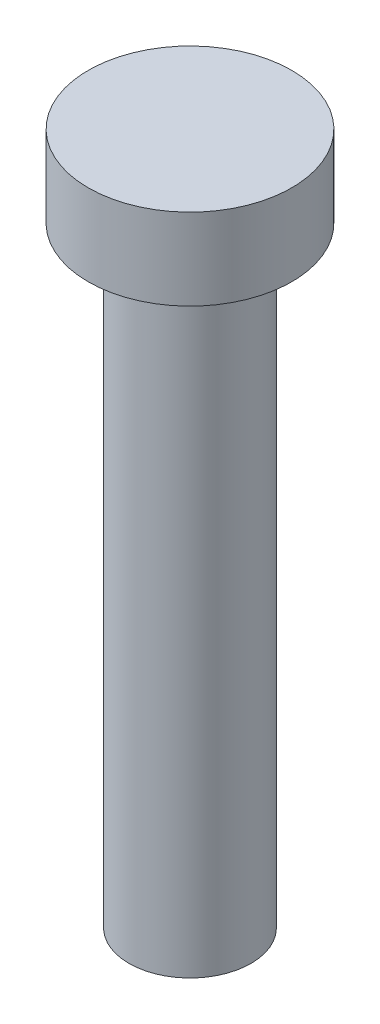
ISO-10303-21;
HEADER;
FILE_DESCRIPTION(('STEP AP214'),'2;1');
FILE_NAME('part.step','',(''),(''),'','','');
FILE_SCHEMA(('AUTOMOTIVE_DESIGN { 1 0 10303 214 1 1 1 1 }'));
ENDSEC;
DATA;
#1=APPLICATION_CONTEXT('core data for automotive mechanical design processes');
#2=APPLICATION_PROTOCOL_DEFINITION('international standard','automotive_design',2000,#1);
#3=PRODUCT_CONTEXT('',#1,'mechanical');
#4=PRODUCT('Part','Part','',(#3));
#5=PRODUCT_RELATED_PRODUCT_CATEGORY('part','',(#4));
#6=PRODUCT_DEFINITION_FORMATION('','',#4);
#7=PRODUCT_DEFINITION_CONTEXT('part definition',#1,'design');
#8=PRODUCT_DEFINITION('design','',#6,#7);
#9=PRODUCT_DEFINITION_SHAPE('','',#8);
#10=(LENGTH_UNIT() NAMED_UNIT(*) SI_UNIT(.MILLI.,.METRE.));
#11=(NAMED_UNIT(*) PLANE_ANGLE_UNIT() SI_UNIT($,.RADIAN.));
#12=(NAMED_UNIT(*) SI_UNIT($,.STERADIAN.) SOLID_ANGLE_UNIT());
#13=UNCERTAINTY_MEASURE_WITH_UNIT(LENGTH_MEASURE(1.E-05),#10,'distance_accuracy_value','');
#14=(GEOMETRIC_REPRESENTATION_CONTEXT(3) GLOBAL_UNCERTAINTY_ASSIGNED_CONTEXT((#13)) GLOBAL_UNIT_ASSIGNED_CONTEXT((#10,
#11,#12)) REPRESENTATION_CONTEXT('',''));
#15=CARTESIAN_POINT('',(0.,0.,0.));
#16=DIRECTION('',(0.,0.,1.));
#17=DIRECTION('',(1.,0.,0.));
#18=AXIS2_PLACEMENT_3D('',#15,#16,#17);
#19=CARTESIAN_POINT('',(0.,15.,0.));
#20=DIRECTION('',(0.,-1.,0.));
#21=DIRECTION('',(0.,0.,-1.));
#22=AXIS2_PLACEMENT_3D('',#19,#20,#21);
#23=CYLINDRICAL_SURFACE('',#22,1.5);
#24=CARTESIAN_POINT('',(0.,15.,0.));
#25=DIRECTION('',(0.,1.,0.));
#26=DIRECTION('',(0.,0.,1.));
#27=AXIS2_PLACEMENT_3D('',#24,#25,#26);
#28=CIRCLE('',#27,1.5);
#29=CARTESIAN_POINT('',(0.,15.,1.5));
#30=VERTEX_POINT('',#29);
#31=EDGE_CURVE('E10',#30,#30,#28,.T.);
#32=ORIENTED_EDGE('',*,*,#31,.F.);
#33=EDGE_LOOP('',(#32));
#34=FACE_BOUND('',#33,.T.);
#35=CARTESIAN_POINT('',(0.,0.,0.));
#36=DIRECTION('',(0.,1.,0.));
#37=DIRECTION('',(0.,0.,1.));
#38=AXIS2_PLACEMENT_3D('',#35,#36,#37);
#39=CIRCLE('',#38,1.5);
#40=CARTESIAN_POINT('',(0.,0.,1.5));
#41=VERTEX_POINT('',#40);
#42=EDGE_CURVE('E33',#41,#41,#39,.T.);
#43=ORIENTED_EDGE('',*,*,#42,.T.);
#44=EDGE_LOOP('',(#43));
#45=FACE_BOUND('',#44,.T.);
#46=ADVANCED_FACE('F30',(#34,#45),#23,.T.);
#47=CARTESIAN_POINT('',(0.,0.,0.));
#48=DIRECTION('',(0.,1.,0.));
#49=DIRECTION('',(0.,0.,1.));
#50=AXIS2_PLACEMENT_3D('',#47,#48,#49);
#51=PLANE('',#50);
#52=ORIENTED_EDGE('',*,*,#42,.F.);
#53=EDGE_LOOP('',(#52));
#54=FACE_BOUND('',#53,.T.);
#55=ADVANCED_FACE('F58',(#54),#51,.F.);
#56=CARTESIAN_POINT('',(0.,15.,0.));
#57=DIRECTION('',(0.,1.,0.));
#58=DIRECTION('',(0.,0.,1.));
#59=AXIS2_PLACEMENT_3D('',#56,#57,#58);
#60=PLANE('',#59);
#61=CARTESIAN_POINT('',(0.,15.,0.));
#62=DIRECTION('',(0.,1.,0.));
#63=DIRECTION('',(0.,0.,1.));
#64=AXIS2_PLACEMENT_3D('',#61,#62,#63);
#65=CIRCLE('',#64,2.5);
#66=CARTESIAN_POINT('',(0.,15.,2.5));
#67=VERTEX_POINT('',#66);
#68=EDGE_CURVE('E42',#67,#67,#65,.T.);
#69=ORIENTED_EDGE('',*,*,#68,.F.);
#70=EDGE_LOOP('',(#69));
#71=FACE_BOUND('',#70,.T.);
#72=ORIENTED_EDGE('',*,*,#31,.T.);
#73=EDGE_LOOP('',(#72));
#74=FACE_BOUND('',#73,.T.);
#75=ADVANCED_FACE('F53',(#71,#74),#60,.F.);
#76=CARTESIAN_POINT('',(0.,17.,0.));
#77=DIRECTION('',(0.,-1.,0.));
#78=DIRECTION('',(0.,0.,-1.));
#79=AXIS2_PLACEMENT_3D('',#76,#77,#78);
#80=CYLINDRICAL_SURFACE('',#79,2.5);
#81=CARTESIAN_POINT('',(0.,17.,0.));
#82=DIRECTION('',(0.,1.,0.));
#83=DIRECTION('',(0.,0.,1.));
#84=AXIS2_PLACEMENT_3D('',#81,#82,#83);
#85=CIRCLE('',#84,2.5);
#86=CARTESIAN_POINT('',(0.,17.,2.5));
#87=VERTEX_POINT('',#86);
#88=EDGE_CURVE('E40',#87,#87,#85,.T.);
#89=ORIENTED_EDGE('',*,*,#88,.F.);
#90=EDGE_LOOP('',(#89));
#91=FACE_BOUND('',#90,.T.);
#92=ORIENTED_EDGE('',*,*,#68,.T.);
#93=EDGE_LOOP('',(#92));
#94=FACE_BOUND('',#93,.T.);
#95=ADVANCED_FACE('F50',(#91,#94),#80,.T.);
#96=CARTESIAN_POINT('',(0.,17.,0.));
#97=DIRECTION('',(0.,1.,0.));
#98=DIRECTION('',(0.,0.,1.));
#99=AXIS2_PLACEMENT_3D('',#96,#97,#98);
#100=PLANE('',#99);
#101=ORIENTED_EDGE('',*,*,#88,.T.);
#102=EDGE_LOOP('',(#101));
#103=FACE_BOUND('',#102,.T.);
#104=ADVANCED_FACE('F48',(#103),#100,.T.);
#105=CLOSED_SHELL('',(#46,#55,#75,#95,#104));
#106=MANIFOLD_SOLID_BREP('B2',#105);
#107=ADVANCED_BREP_SHAPE_REPRESENTATION('',(#18,#106),#14);
#108=SHAPE_DEFINITION_REPRESENTATION(#9,#107);
ENDSEC;
END-ISO-10303-21;
